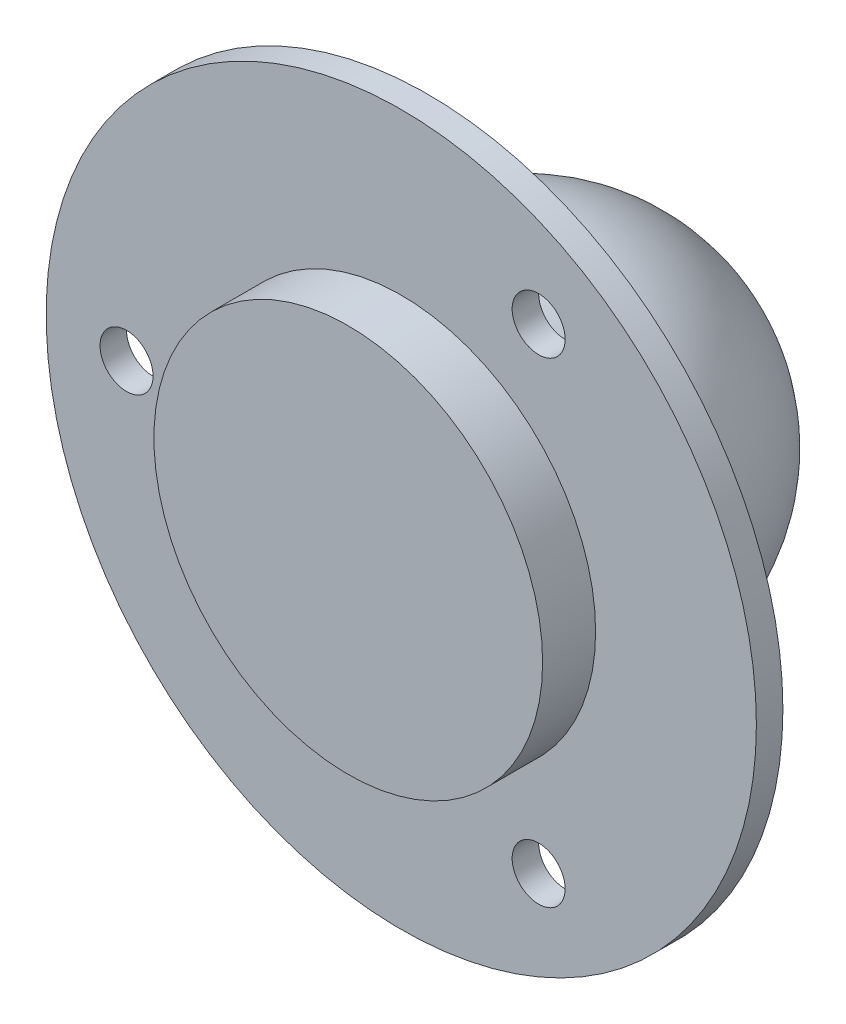
ISO-10303-21;
HEADER;
FILE_DESCRIPTION(('STEP AP214'),'2;1');
FILE_NAME('part.step','',(''),(''),'','','');
FILE_SCHEMA(('AUTOMOTIVE_DESIGN { 1 0 10303 214 1 1 1 1 }'));
ENDSEC;
DATA;
#1=APPLICATION_CONTEXT('core data for automotive mechanical design processes');
#2=APPLICATION_PROTOCOL_DEFINITION('international standard','automotive_design',2000,#1);
#3=PRODUCT_CONTEXT('',#1,'mechanical');
#4=PRODUCT('Part','Part','',(#3));
#5=PRODUCT_RELATED_PRODUCT_CATEGORY('part','',(#4));
#6=PRODUCT_DEFINITION_FORMATION('','',#4);
#7=PRODUCT_DEFINITION_CONTEXT('part definition',#1,'design');
#8=PRODUCT_DEFINITION('design','',#6,#7);
#9=PRODUCT_DEFINITION_SHAPE('','',#8);
#10=(LENGTH_UNIT() NAMED_UNIT(*) SI_UNIT(.MILLI.,.METRE.));
#11=(NAMED_UNIT(*) PLANE_ANGLE_UNIT() SI_UNIT($,.RADIAN.));
#12=(NAMED_UNIT(*) SI_UNIT($,.STERADIAN.) SOLID_ANGLE_UNIT());
#13=UNCERTAINTY_MEASURE_WITH_UNIT(LENGTH_MEASURE(1.E-05),#10,'distance_accuracy_value','');
#14=(GEOMETRIC_REPRESENTATION_CONTEXT(3) GLOBAL_UNCERTAINTY_ASSIGNED_CONTEXT((#13)) GLOBAL_UNIT_ASSIGNED_CONTEXT((#10,
#11,#12)) REPRESENTATION_CONTEXT('',''));
#15=CARTESIAN_POINT('',(0.,0.,0.));
#16=DIRECTION('',(0.,0.,1.));
#17=DIRECTION('',(1.,0.,0.));
#18=AXIS2_PLACEMENT_3D('',#15,#16,#17);
#19=CARTESIAN_POINT('',(0.,0.,1.5));
#20=DIRECTION('',(0.,0.,-1.));
#21=DIRECTION('',(-1.,0.,0.));
#22=AXIS2_PLACEMENT_3D('',#19,#20,#21);
#23=CYLINDRICAL_SURFACE('',#22,20.1);
#24=CARTESIAN_POINT('',(0.,0.,1.5));
#25=DIRECTION('',(0.,0.,1.));
#26=DIRECTION('',(1.,0.,0.));
#27=AXIS2_PLACEMENT_3D('',#24,#25,#26);
#28=CIRCLE('',#27,20.1);
#29=CARTESIAN_POINT('',(20.1,0.,1.5));
#30=VERTEX_POINT('',#29);
#31=EDGE_CURVE('E42',#30,#30,#28,.T.);
#32=ORIENTED_EDGE('',*,*,#31,.F.);
#33=EDGE_LOOP('',(#32));
#34=FACE_BOUND('',#33,.T.);
#35=CARTESIAN_POINT('',(0.,0.,0.));
#36=DIRECTION('',(0.,0.,1.));
#37=DIRECTION('',(1.,0.,0.));
#38=AXIS2_PLACEMENT_3D('',#35,#36,#37);
#39=CIRCLE('',#38,20.1);
#40=CARTESIAN_POINT('',(20.1,0.,0.));
#41=VERTEX_POINT('',#40);
#42=EDGE_CURVE('E47',#41,#41,#39,.T.);
#43=ORIENTED_EDGE('',*,*,#42,.T.);
#44=EDGE_LOOP('',(#43));
#45=FACE_BOUND('',#44,.T.);
#46=ADVANCED_FACE('F31',(#34,#45),#23,.T.);
#47=CARTESIAN_POINT('',(0.,0.,1.5));
#48=DIRECTION('',(0.,0.,1.));
#49=DIRECTION('',(1.,0.,0.));
#50=AXIS2_PLACEMENT_3D('',#47,#48,#49);
#51=PLANE('',#50);
#52=CARTESIAN_POINT('',(-15.55,0.,1.5));
#53=DIRECTION('',(0.,0.,1.));
#54=DIRECTION('',(1.,0.,0.));
#55=AXIS2_PLACEMENT_3D('',#52,#53,#54);
#56=CIRCLE('',#55,1.5);
#57=CARTESIAN_POINT('',(-14.05,0.,1.5));
#58=VERTEX_POINT('',#57);
#59=EDGE_CURVE('E67',#58,#58,#56,.T.);
#60=ORIENTED_EDGE('',*,*,#59,.F.);
#61=EDGE_LOOP('',(#60));
#62=FACE_BOUND('',#61,.T.);
#63=CARTESIAN_POINT('',(7.77499999999988,-13.4666950288481,1.5));
#64=DIRECTION('',(0.,0.,1.));
#65=DIRECTION('',(1.,0.,0.));
#66=AXIS2_PLACEMENT_3D('',#63,#64,#65);
#67=CIRCLE('',#66,1.5);
#68=CARTESIAN_POINT('',(9.27499999999988,-13.4666950288481,1.5));
#69=VERTEX_POINT('',#68);
#70=EDGE_CURVE('E64',#69,#69,#67,.T.);
#71=ORIENTED_EDGE('',*,*,#70,.F.);
#72=EDGE_LOOP('',(#71));
#73=FACE_BOUND('',#72,.T.);
#74=CARTESIAN_POINT('',(7.77500000000007,13.466695028848,1.5));
#75=DIRECTION('',(0.,0.,1.));
#76=DIRECTION('',(1.,0.,0.));
#77=AXIS2_PLACEMENT_3D('',#74,#75,#76);
#78=CIRCLE('',#77,1.5);
#79=CARTESIAN_POINT('',(9.27500000000006,13.466695028848,1.5));
#80=VERTEX_POINT('',#79);
#81=EDGE_CURVE('E61',#80,#80,#78,.T.);
#82=ORIENTED_EDGE('',*,*,#81,.F.);
#83=EDGE_LOOP('',(#82));
#84=FACE_BOUND('',#83,.T.);
#85=CARTESIAN_POINT('',(0.,0.,1.5));
#86=DIRECTION('',(0.,0.,1.));
#87=DIRECTION('',(1.,0.,0.));
#88=AXIS2_PLACEMENT_3D('',#85,#86,#87);
#89=CIRCLE('',#88,11.);
#90=CARTESIAN_POINT('',(11.,0.,1.5));
#91=VERTEX_POINT('',#90);
#92=EDGE_CURVE('E38',#91,#91,#89,.T.);
#93=ORIENTED_EDGE('',*,*,#92,.F.);
#94=EDGE_LOOP('',(#93));
#95=FACE_BOUND('',#94,.T.);
#96=ORIENTED_EDGE('',*,*,#31,.T.);
#97=EDGE_LOOP('',(#96));
#98=FACE_BOUND('',#97,.T.);
#99=ADVANCED_FACE('F82',(#62,#73,#84,#95,#98),#51,.T.);
#100=CARTESIAN_POINT('',(0.,0.,0.));
#101=DIRECTION('',(0.,0.,1.));
#102=DIRECTION('',(1.,0.,0.));
#103=AXIS2_PLACEMENT_3D('',#100,#101,#102);
#104=PLANE('',#103);
#105=CARTESIAN_POINT('',(-15.55,0.,0.));
#106=DIRECTION('',(0.,0.,1.));
#107=DIRECTION('',(1.,0.,0.));
#108=AXIS2_PLACEMENT_3D('',#105,#106,#107);
#109=CIRCLE('',#108,1.5);
#110=CARTESIAN_POINT('',(-14.05,0.,0.));
#111=VERTEX_POINT('',#110);
#112=EDGE_CURVE('E65',#111,#111,#109,.T.);
#113=ORIENTED_EDGE('',*,*,#112,.T.);
#114=EDGE_LOOP('',(#113));
#115=FACE_BOUND('',#114,.T.);
#116=CARTESIAN_POINT('',(7.77499999999988,-13.4666950288481,0.));
#117=DIRECTION('',(0.,0.,1.));
#118=DIRECTION('',(1.,0.,0.));
#119=AXIS2_PLACEMENT_3D('',#116,#117,#118);
#120=CIRCLE('',#119,1.5);
#121=CARTESIAN_POINT('',(9.27499999999988,-13.4666950288481,0.));
#122=VERTEX_POINT('',#121);
#123=EDGE_CURVE('E62',#122,#122,#120,.T.);
#124=ORIENTED_EDGE('',*,*,#123,.T.);
#125=EDGE_LOOP('',(#124));
#126=FACE_BOUND('',#125,.T.);
#127=CARTESIAN_POINT('',(7.77500000000007,13.466695028848,0.));
#128=DIRECTION('',(0.,0.,1.));
#129=DIRECTION('',(1.,0.,0.));
#130=AXIS2_PLACEMENT_3D('',#127,#128,#129);
#131=CIRCLE('',#130,1.5);
#132=CARTESIAN_POINT('',(9.27500000000006,13.466695028848,0.));
#133=VERTEX_POINT('',#132);
#134=EDGE_CURVE('E58',#133,#133,#131,.T.);
#135=ORIENTED_EDGE('',*,*,#134,.T.);
#136=EDGE_LOOP('',(#135));
#137=FACE_BOUND('',#136,.T.);
#138=CARTESIAN_POINT('',(0.,0.,0.));
#139=DIRECTION('',(0.,0.,1.));
#140=DIRECTION('',(1.,0.,0.));
#141=AXIS2_PLACEMENT_3D('',#138,#139,#140);
#142=CIRCLE('',#141,11.);
#143=CARTESIAN_POINT('',(11.,0.,0.));
#144=VERTEX_POINT('',#143);
#145=EDGE_CURVE('E55',#144,#144,#142,.T.);
#146=ORIENTED_EDGE('',*,*,#145,.T.);
#147=EDGE_LOOP('',(#146));
#148=FACE_BOUND('',#147,.T.);
#149=ORIENTED_EDGE('',*,*,#42,.F.);
#150=EDGE_LOOP('',(#149));
#151=FACE_BOUND('',#150,.T.);
#152=ADVANCED_FACE('F85',(#115,#126,#137,#148,#151),#104,.F.);
#153=CARTESIAN_POINT('',(0.,0.,-16.5));
#154=DIRECTION('',(0.,0.,1.));
#155=DIRECTION('',(1.,0.,0.));
#156=AXIS2_PLACEMENT_3D('',#153,#154,#155);
#157=CYLINDRICAL_SURFACE('',#156,11.);
#158=CARTESIAN_POINT('',(0.,0.,-5.5));
#159=DIRECTION('',(0.,0.,1.));
#160=DIRECTION('',(1.,0.,0.));
#161=AXIS2_PLACEMENT_3D('',#158,#159,#160);
#162=CIRCLE('',#161,11.);
#163=CARTESIAN_POINT('',(11.,0.,-5.5));
#164=VERTEX_POINT('',#163);
#165=EDGE_CURVE('E10',#164,#164,#162,.T.);
#166=ORIENTED_EDGE('',*,*,#165,.T.);
#167=EDGE_LOOP('',(#166));
#168=FACE_BOUND('',#167,.T.);
#169=ORIENTED_EDGE('',*,*,#145,.F.);
#170=EDGE_LOOP('',(#169));
#171=FACE_BOUND('',#170,.T.);
#172=ADVANCED_FACE('F96',(#168,#171),#157,.T.);
#173=ORIENTED_EDGE('',*,*,#92,.T.);
#174=EDGE_LOOP('',(#173));
#175=FACE_BOUND('',#174,.T.);
#176=CARTESIAN_POINT('',(0.,0.,4.5));
#177=DIRECTION('',(0.,0.,1.));
#178=DIRECTION('',(1.,0.,0.));
#179=AXIS2_PLACEMENT_3D('',#176,#177,#178);
#180=CIRCLE('',#179,11.);
#181=CARTESIAN_POINT('',(11.,0.,4.5));
#182=VERTEX_POINT('',#181);
#183=EDGE_CURVE('E50',#182,#182,#180,.T.);
#184=ORIENTED_EDGE('',*,*,#183,.F.);
#185=EDGE_LOOP('',(#184));
#186=FACE_BOUND('',#185,.T.);
#187=ADVANCED_FACE('F101',(#175,#186),#157,.T.);
#188=CARTESIAN_POINT('',(0.,0.,4.5));
#189=DIRECTION('',(0.,0.,1.));
#190=DIRECTION('',(1.,0.,0.));
#191=AXIS2_PLACEMENT_3D('',#188,#189,#190);
#192=PLANE('',#191);
#193=ORIENTED_EDGE('',*,*,#183,.T.);
#194=EDGE_LOOP('',(#193));
#195=FACE_BOUND('',#194,.T.);
#196=ADVANCED_FACE('F106',(#195),#192,.T.);
#197=CARTESIAN_POINT('',(7.77500000000007,13.466695028848,-16.5));
#198=DIRECTION('',(0.,0.,1.));
#199=DIRECTION('',(1.,0.,0.));
#200=AXIS2_PLACEMENT_3D('',#197,#198,#199);
#201=CYLINDRICAL_SURFACE('',#200,1.5);
#202=ORIENTED_EDGE('',*,*,#81,.T.);
#203=EDGE_LOOP('',(#202));
#204=FACE_BOUND('',#203,.T.);
#205=ORIENTED_EDGE('',*,*,#134,.F.);
#206=EDGE_LOOP('',(#205));
#207=FACE_BOUND('',#206,.T.);
#208=ADVANCED_FACE('F79',(#204,#207),#201,.F.);
#209=CARTESIAN_POINT('',(7.77499999999988,-13.4666950288481,-16.5));
#210=DIRECTION('',(0.,0.,1.));
#211=DIRECTION('',(1.,0.,0.));
#212=AXIS2_PLACEMENT_3D('',#209,#210,#211);
#213=CYLINDRICAL_SURFACE('',#212,1.5);
#214=ORIENTED_EDGE('',*,*,#70,.T.);
#215=EDGE_LOOP('',(#214));
#216=FACE_BOUND('',#215,.T.);
#217=ORIENTED_EDGE('',*,*,#123,.F.);
#218=EDGE_LOOP('',(#217));
#219=FACE_BOUND('',#218,.T.);
#220=ADVANCED_FACE('F112',(#216,#219),#213,.F.);
#221=CARTESIAN_POINT('',(-15.55,0.,-16.5));
#222=DIRECTION('',(0.,0.,1.));
#223=DIRECTION('',(1.,0.,0.));
#224=AXIS2_PLACEMENT_3D('',#221,#222,#223);
#225=CYLINDRICAL_SURFACE('',#224,1.5);
#226=ORIENTED_EDGE('',*,*,#59,.T.);
#227=EDGE_LOOP('',(#226));
#228=FACE_BOUND('',#227,.T.);
#229=ORIENTED_EDGE('',*,*,#112,.F.);
#230=EDGE_LOOP('',(#229));
#231=FACE_BOUND('',#230,.T.);
#232=ADVANCED_FACE('F115',(#228,#231),#225,.F.);
#233=CARTESIAN_POINT('',(0.,0.,-5.5));
#234=DIRECTION('',(0.,0.,1.));
#235=DIRECTION('',(1.,0.,0.));
#236=AXIS2_PLACEMENT_3D('',#233,#234,#235);
#237=SPHERICAL_SURFACE('',#236,11.);
#238=ORIENTED_EDGE('',*,*,#165,.F.);
#239=EDGE_LOOP('',(#238));
#240=FACE_BOUND('',#239,.T.);
#241=ADVANCED_FACE('F33',(#240),#237,.T.);
#242=CLOSED_SHELL('',(#46,#99,#152,#172,#187,#196,#208,#220,#232,#241));
#243=MANIFOLD_SOLID_BREP('B2',#242);
#244=ADVANCED_BREP_SHAPE_REPRESENTATION('',(#18,#243),#14);
#245=SHAPE_DEFINITION_REPRESENTATION(#9,#244);
ENDSEC;
END-ISO-10303-21;
